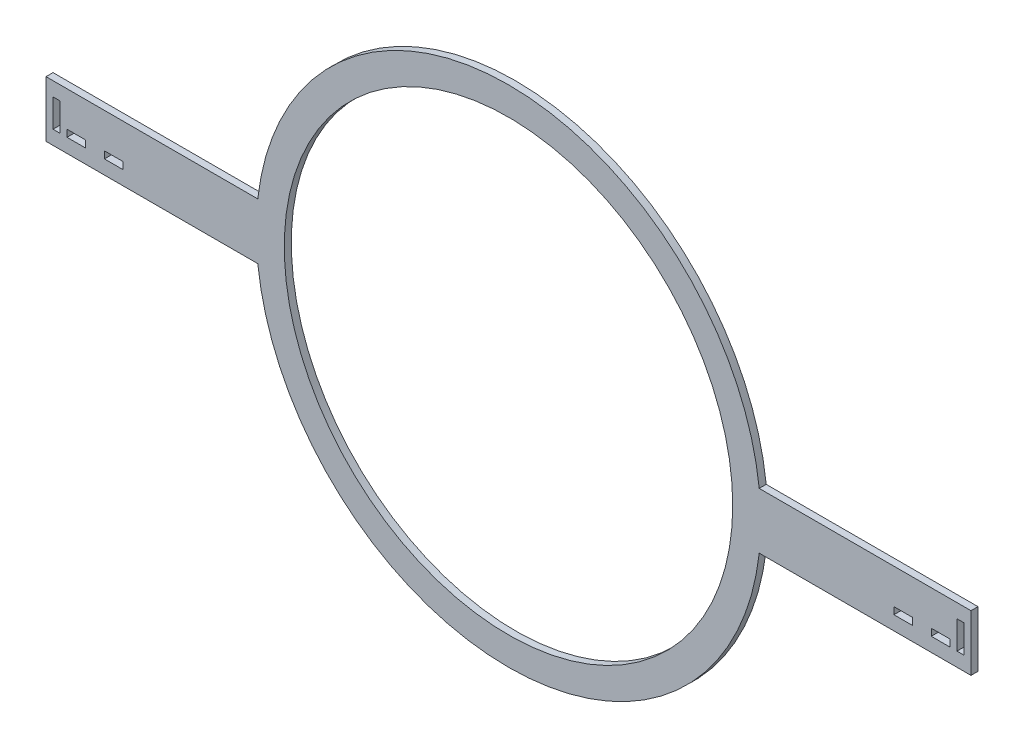
ISO-10303-21;
HEADER;
FILE_DESCRIPTION(('STEP AP214'),'2;1');
FILE_NAME('part.step','',(''),(''),'','','');
FILE_SCHEMA(('AUTOMOTIVE_DESIGN { 1 0 10303 214 1 1 1 1 }'));
ENDSEC;
DATA;
#1=APPLICATION_CONTEXT('core data for automotive mechanical design processes');
#2=APPLICATION_PROTOCOL_DEFINITION('international standard','automotive_design',2000,#1);
#3=PRODUCT_CONTEXT('',#1,'mechanical');
#4=PRODUCT('Part','Part','',(#3));
#5=PRODUCT_RELATED_PRODUCT_CATEGORY('part','',(#4));
#6=PRODUCT_DEFINITION_FORMATION('','',#4);
#7=PRODUCT_DEFINITION_CONTEXT('part definition',#1,'design');
#8=PRODUCT_DEFINITION('design','',#6,#7);
#9=PRODUCT_DEFINITION_SHAPE('','',#8);
#10=(LENGTH_UNIT() NAMED_UNIT(*) SI_UNIT(.MILLI.,.METRE.));
#11=(NAMED_UNIT(*) PLANE_ANGLE_UNIT() SI_UNIT($,.RADIAN.));
#12=(NAMED_UNIT(*) SI_UNIT($,.STERADIAN.) SOLID_ANGLE_UNIT());
#13=UNCERTAINTY_MEASURE_WITH_UNIT(LENGTH_MEASURE(1.E-05),#10,'distance_accuracy_value','');
#14=(GEOMETRIC_REPRESENTATION_CONTEXT(3) GLOBAL_UNCERTAINTY_ASSIGNED_CONTEXT((#13)) GLOBAL_UNIT_ASSIGNED_CONTEXT((#10,
#11,#12)) REPRESENTATION_CONTEXT('',''));
#15=CARTESIAN_POINT('',(0.,0.,0.));
#16=DIRECTION('',(0.,0.,1.));
#17=DIRECTION('',(1.,0.,0.));
#18=AXIS2_PLACEMENT_3D('',#15,#16,#17);
#19=CARTESIAN_POINT('',(0.,0.,3.175));
#20=DIRECTION('',(0.,0.,1.));
#21=DIRECTION('',(1.,0.,0.));
#22=AXIS2_PLACEMENT_3D('',#19,#20,#21);
#23=PLANE('',#22);
#24=DIRECTION('',(0.,1.,0.));
#25=VECTOR('',#24,1.);
#26=CARTESIAN_POINT('',(200.025,-3.175,3.175));
#27=LINE('',#26,#25);
#28=CARTESIAN_POINT('',(200.025,-6.35,3.175));
#29=VERTEX_POINT('',#28);
#30=CARTESIAN_POINT('',(200.025,-3.175,3.175));
#31=VERTEX_POINT('',#30);
#32=EDGE_CURVE('E325',#29,#31,#27,.T.);
#33=ORIENTED_EDGE('',*,*,#32,.F.);
#34=DIRECTION('',(1.,0.,0.));
#35=VECTOR('',#34,1.);
#36=CARTESIAN_POINT('',(200.025,-6.35,3.175));
#37=LINE('',#36,#35);
#38=CARTESIAN_POINT('',(191.558333333333,-6.35,3.175));
#39=VERTEX_POINT('',#38);
#40=EDGE_CURVE('E315',#39,#29,#37,.T.);
#41=ORIENTED_EDGE('',*,*,#40,.F.);
#42=DIRECTION('',(0.,-1.,0.));
#43=VECTOR('',#42,1.);
#44=CARTESIAN_POINT('',(191.558333333333,-3.175,3.175));
#45=LINE('',#44,#43);
#46=CARTESIAN_POINT('',(191.558333333333,-3.175,3.175));
#47=VERTEX_POINT('',#46);
#48=EDGE_CURVE('E331',#47,#39,#45,.T.);
#49=ORIENTED_EDGE('',*,*,#48,.F.);
#50=DIRECTION('',(-1.,0.,0.));
#51=VECTOR('',#50,1.);
#52=CARTESIAN_POINT('',(200.025,-3.175,3.175));
#53=LINE('',#52,#51);
#54=EDGE_CURVE('E327',#31,#47,#53,.T.);
#55=ORIENTED_EDGE('',*,*,#54,.F.);
#56=EDGE_LOOP('',(#33,#41,#49,#55));
#57=FACE_BOUND('',#56,.T.);
#58=DIRECTION('',(0.,1.,0.));
#59=VECTOR('',#58,1.);
#60=CARTESIAN_POINT('',(183.091666666667,-3.175,3.175));
#61=LINE('',#60,#59);
#62=CARTESIAN_POINT('',(183.091666666667,-6.35,3.175));
#63=VERTEX_POINT('',#62);
#64=CARTESIAN_POINT('',(183.091666666667,-3.175,3.175));
#65=VERTEX_POINT('',#64);
#66=EDGE_CURVE('E281',#63,#65,#61,.T.);
#67=ORIENTED_EDGE('',*,*,#66,.F.);
#68=DIRECTION('',(1.,0.,0.));
#69=VECTOR('',#68,1.);
#70=CARTESIAN_POINT('',(183.091666666667,-6.35,3.175));
#71=LINE('',#70,#69);
#72=CARTESIAN_POINT('',(174.625,-6.35,3.175));
#73=VERTEX_POINT('',#72);
#74=EDGE_CURVE('E349',#73,#63,#71,.T.);
#75=ORIENTED_EDGE('',*,*,#74,.F.);
#76=DIRECTION('',(0.,-1.,0.));
#77=VECTOR('',#76,1.);
#78=CARTESIAN_POINT('',(174.625,-3.175,3.175));
#79=LINE('',#78,#77);
#80=CARTESIAN_POINT('',(174.625,-3.175,3.175));
#81=VERTEX_POINT('',#80);
#82=EDGE_CURVE('E363',#81,#73,#79,.T.);
#83=ORIENTED_EDGE('',*,*,#82,.F.);
#84=DIRECTION('',(-1.,0.,0.));
#85=VECTOR('',#84,1.);
#86=CARTESIAN_POINT('',(183.091666666667,-3.175,3.175));
#87=LINE('',#86,#85);
#88=EDGE_CURVE('E360',#65,#81,#87,.T.);
#89=ORIENTED_EDGE('',*,*,#88,.F.);
#90=EDGE_LOOP('',(#67,#75,#83,#89));
#91=FACE_BOUND('',#90,.T.);
#92=DIRECTION('',(0.,-1.,0.));
#93=VECTOR('',#92,1.);
#94=CARTESIAN_POINT('',(-206.375,6.35,3.175));
#95=LINE('',#94,#93);
#96=CARTESIAN_POINT('',(-206.375,6.35,3.175));
#97=VERTEX_POINT('',#96);
#98=CARTESIAN_POINT('',(-206.375,-6.35,3.175));
#99=VERTEX_POINT('',#98);
#100=EDGE_CURVE('E399',#97,#99,#95,.T.);
#101=ORIENTED_EDGE('',*,*,#100,.F.);
#102=DIRECTION('',(-1.,0.,0.));
#103=VECTOR('',#102,1.);
#104=CARTESIAN_POINT('',(-206.375,6.35,3.175));
#105=LINE('',#104,#103);
#106=CARTESIAN_POINT('',(-203.2,6.35,3.175));
#107=VERTEX_POINT('',#106);
#108=EDGE_CURVE('E410',#107,#97,#105,.T.);
#109=ORIENTED_EDGE('',*,*,#108,.F.);
#110=DIRECTION('',(0.,1.,0.));
#111=VECTOR('',#110,1.);
#112=CARTESIAN_POINT('',(-203.2,6.35,3.175));
#113=LINE('',#112,#111);
#114=CARTESIAN_POINT('',(-203.2,-6.35,3.175));
#115=VERTEX_POINT('',#114);
#116=EDGE_CURVE('E424',#115,#107,#113,.T.);
#117=ORIENTED_EDGE('',*,*,#116,.F.);
#118=DIRECTION('',(1.,0.,0.));
#119=VECTOR('',#118,1.);
#120=CARTESIAN_POINT('',(-206.375,-6.35,3.175));
#121=LINE('',#120,#119);
#122=EDGE_CURVE('E421',#99,#115,#121,.T.);
#123=ORIENTED_EDGE('',*,*,#122,.F.);
#124=EDGE_LOOP('',(#101,#109,#117,#123));
#125=FACE_BOUND('',#124,.T.);
#126=DIRECTION('',(-1.,0.,0.));
#127=VECTOR('',#126,1.);
#128=CARTESIAN_POINT('',(0.,-12.7,3.175));
#129=LINE('',#128,#127);
#130=CARTESIAN_POINT('',(-113.592253256989,-12.7,3.175));
#131=VERTEX_POINT('',#130);
#132=CARTESIAN_POINT('',(-209.55,-12.7,3.175));
#133=VERTEX_POINT('',#132);
#134=EDGE_CURVE('E438',#131,#133,#129,.T.);
#135=ORIENTED_EDGE('',*,*,#134,.F.);
#136=CARTESIAN_POINT('',(0.,0.,3.175));
#137=DIRECTION('',(0.,0.,1.));
#138=DIRECTION('',(1.,0.,0.));
#139=AXIS2_PLACEMENT_3D('',#136,#137,#138);
#140=CIRCLE('',#139,114.3);
#141=CARTESIAN_POINT('',(113.592253256989,-12.7,3.175));
#142=VERTEX_POINT('',#141);
#143=EDGE_CURVE('E441',#131,#142,#140,.T.);
#144=ORIENTED_EDGE('',*,*,#143,.T.);
#145=DIRECTION('',(1.,0.,0.));
#146=VECTOR('',#145,1.);
#147=CARTESIAN_POINT('',(0.,-12.7,3.175));
#148=LINE('',#147,#146);
#149=CARTESIAN_POINT('',(209.55,-12.7,3.175));
#150=VERTEX_POINT('',#149);
#151=EDGE_CURVE('E444',#142,#150,#148,.T.);
#152=ORIENTED_EDGE('',*,*,#151,.T.);
#153=DIRECTION('',(0.,1.,0.));
#154=VECTOR('',#153,1.);
#155=CARTESIAN_POINT('',(209.55,0.,3.175));
#156=LINE('',#155,#154);
#157=CARTESIAN_POINT('',(209.55,12.7,3.175));
#158=VERTEX_POINT('',#157);
#159=EDGE_CURVE('E447',#150,#158,#156,.T.);
#160=ORIENTED_EDGE('',*,*,#159,.T.);
#161=DIRECTION('',(-1.,0.,0.));
#162=VECTOR('',#161,1.);
#163=CARTESIAN_POINT('',(0.,12.7,3.175));
#164=LINE('',#163,#162);
#165=CARTESIAN_POINT('',(113.592253256989,12.7,3.175));
#166=VERTEX_POINT('',#165);
#167=EDGE_CURVE('E449',#158,#166,#164,.T.);
#168=ORIENTED_EDGE('',*,*,#167,.T.);
#169=CARTESIAN_POINT('',(-113.592253256989,12.7,3.175));
#170=VERTEX_POINT('',#169);
#171=EDGE_CURVE('E445',#166,#170,#140,.T.);
#172=ORIENTED_EDGE('',*,*,#171,.T.);
#173=DIRECTION('',(1.,0.,0.));
#174=VECTOR('',#173,1.);
#175=CARTESIAN_POINT('',(0.,12.7,3.175));
#176=LINE('',#175,#174);
#177=CARTESIAN_POINT('',(-209.55,12.7,3.175));
#178=VERTEX_POINT('',#177);
#179=EDGE_CURVE('E451',#178,#170,#176,.T.);
#180=ORIENTED_EDGE('',*,*,#179,.F.);
#181=DIRECTION('',(0.,1.,0.));
#182=VECTOR('',#181,1.);
#183=CARTESIAN_POINT('',(-209.55,0.,3.175));
#184=LINE('',#183,#182);
#185=EDGE_CURVE('E454',#133,#178,#184,.T.);
#186=ORIENTED_EDGE('',*,*,#185,.F.);
#187=EDGE_LOOP('',(#135,#144,#152,#160,#168,#172,#180,#186));
#188=FACE_BOUND('',#187,.T.);
#189=CARTESIAN_POINT('',(0.,0.,3.175));
#190=DIRECTION('',(0.,0.,1.));
#191=DIRECTION('',(1.,0.,0.));
#192=AXIS2_PLACEMENT_3D('',#189,#190,#191);
#193=CIRCLE('',#192,101.6);
#194=CARTESIAN_POINT('',(101.6,0.,3.175));
#195=VERTEX_POINT('',#194);
#196=EDGE_CURVE('E457',#195,#195,#193,.T.);
#197=ORIENTED_EDGE('',*,*,#196,.F.);
#198=EDGE_LOOP('',(#197));
#199=FACE_BOUND('',#198,.T.);
#200=DIRECTION('',(1.,0.,0.));
#201=VECTOR('',#200,1.);
#202=CARTESIAN_POINT('',(206.375,6.35,3.175));
#203=LINE('',#202,#201);
#204=CARTESIAN_POINT('',(203.2,6.35,3.175));
#205=VERTEX_POINT('',#204);
#206=CARTESIAN_POINT('',(206.375,6.35,3.175));
#207=VERTEX_POINT('',#206);
#208=EDGE_CURVE('E388',#205,#207,#203,.T.);
#209=ORIENTED_EDGE('',*,*,#208,.T.);
#210=DIRECTION('',(0.,-1.,0.));
#211=VECTOR('',#210,1.);
#212=CARTESIAN_POINT('',(206.375,6.35,3.175));
#213=LINE('',#212,#211);
#214=CARTESIAN_POINT('',(206.375,-6.35,3.175));
#215=VERTEX_POINT('',#214);
#216=EDGE_CURVE('E338',#207,#215,#213,.T.);
#217=ORIENTED_EDGE('',*,*,#216,.T.);
#218=DIRECTION('',(-1.,0.,0.));
#219=VECTOR('',#218,1.);
#220=CARTESIAN_POINT('',(206.375,-6.35,3.175));
#221=LINE('',#220,#219);
#222=CARTESIAN_POINT('',(203.2,-6.35,3.175));
#223=VERTEX_POINT('',#222);
#224=EDGE_CURVE('E378',#215,#223,#221,.T.);
#225=ORIENTED_EDGE('',*,*,#224,.T.);
#226=DIRECTION('',(0.,1.,0.));
#227=VECTOR('',#226,1.);
#228=CARTESIAN_POINT('',(203.2,6.35,3.175));
#229=LINE('',#228,#227);
#230=EDGE_CURVE('E391',#223,#205,#229,.T.);
#231=ORIENTED_EDGE('',*,*,#230,.T.);
#232=EDGE_LOOP('',(#209,#217,#225,#231));
#233=FACE_BOUND('',#232,.T.);
#234=DIRECTION('',(-1.,0.,0.));
#235=VECTOR('',#234,1.);
#236=CARTESIAN_POINT('',(-183.091666666667,-6.35,3.175));
#237=LINE('',#236,#235);
#238=CARTESIAN_POINT('',(-174.625,-6.35,3.175));
#239=VERTEX_POINT('',#238);
#240=CARTESIAN_POINT('',(-183.091666666667,-6.35,3.175));
#241=VERTEX_POINT('',#240);
#242=EDGE_CURVE('E297',#239,#241,#237,.T.);
#243=ORIENTED_EDGE('',*,*,#242,.T.);
#244=DIRECTION('',(0.,1.,0.));
#245=VECTOR('',#244,1.);
#246=CARTESIAN_POINT('',(-183.091666666667,-3.175,3.175));
#247=LINE('',#246,#245);
#248=CARTESIAN_POINT('',(-183.091666666667,-3.175,3.175));
#249=VERTEX_POINT('',#248);
#250=EDGE_CURVE('E58',#241,#249,#247,.T.);
#251=ORIENTED_EDGE('',*,*,#250,.T.);
#252=DIRECTION('',(1.,0.,0.));
#253=VECTOR('',#252,1.);
#254=CARTESIAN_POINT('',(-183.091666666667,-3.175,3.175));
#255=LINE('',#254,#253);
#256=CARTESIAN_POINT('',(-174.625,-3.175,3.175));
#257=VERTEX_POINT('',#256);
#258=EDGE_CURVE('E288',#249,#257,#255,.T.);
#259=ORIENTED_EDGE('',*,*,#258,.T.);
#260=DIRECTION('',(0.,-1.,0.));
#261=VECTOR('',#260,1.);
#262=CARTESIAN_POINT('',(-174.625,-3.175,3.175));
#263=LINE('',#262,#261);
#264=EDGE_CURVE('E300',#257,#239,#263,.T.);
#265=ORIENTED_EDGE('',*,*,#264,.T.);
#266=EDGE_LOOP('',(#243,#251,#259,#265));
#267=FACE_BOUND('',#266,.T.);
#268=DIRECTION('',(-1.,0.,0.));
#269=VECTOR('',#268,1.);
#270=CARTESIAN_POINT('',(-200.025,-6.35,3.175));
#271=LINE('',#270,#269);
#272=CARTESIAN_POINT('',(-191.558333333333,-6.35,3.175));
#273=VERTEX_POINT('',#272);
#274=CARTESIAN_POINT('',(-200.025,-6.35,3.175));
#275=VERTEX_POINT('',#274);
#276=EDGE_CURVE('E274',#273,#275,#271,.T.);
#277=ORIENTED_EDGE('',*,*,#276,.T.);
#278=DIRECTION('',(0.,1.,0.));
#279=VECTOR('',#278,1.);
#280=CARTESIAN_POINT('',(-200.025,-3.175,3.175));
#281=LINE('',#280,#279);
#282=CARTESIAN_POINT('',(-200.025,-3.175,3.175));
#283=VERTEX_POINT('',#282);
#284=EDGE_CURVE('E50',#275,#283,#281,.T.);
#285=ORIENTED_EDGE('',*,*,#284,.T.);
#286=DIRECTION('',(1.,0.,0.));
#287=VECTOR('',#286,1.);
#288=CARTESIAN_POINT('',(-200.025,-3.175,3.175));
#289=LINE('',#288,#287);
#290=CARTESIAN_POINT('',(-191.558333333333,-3.175,3.175));
#291=VERTEX_POINT('',#290);
#292=EDGE_CURVE('E265',#283,#291,#289,.T.);
#293=ORIENTED_EDGE('',*,*,#292,.T.);
#294=DIRECTION('',(0.,-1.,0.));
#295=VECTOR('',#294,1.);
#296=CARTESIAN_POINT('',(-191.558333333333,-3.175,3.175));
#297=LINE('',#296,#295);
#298=EDGE_CURVE('E268',#291,#273,#297,.T.);
#299=ORIENTED_EDGE('',*,*,#298,.T.);
#300=EDGE_LOOP('',(#277,#285,#293,#299));
#301=FACE_BOUND('',#300,.T.);
#302=ADVANCED_FACE('F35',(#57,#91,#125,#188,#199,#233,#267,#301),#23,.T.);
#303=CARTESIAN_POINT('',(0.,0.,0.));
#304=DIRECTION('',(0.,0.,1.));
#305=DIRECTION('',(1.,0.,0.));
#306=AXIS2_PLACEMENT_3D('',#303,#304,#305);
#307=PLANE('',#306);
#308=DIRECTION('',(0.,1.,0.));
#309=VECTOR('',#308,1.);
#310=CARTESIAN_POINT('',(-183.091666666667,-3.175,0.));
#311=LINE('',#310,#309);
#312=CARTESIAN_POINT('',(-183.091666666667,-6.35,0.));
#313=VERTEX_POINT('',#312);
#314=CARTESIAN_POINT('',(-183.091666666667,-3.175,0.));
#315=VERTEX_POINT('',#314);
#316=EDGE_CURVE('E285',#313,#315,#311,.T.);
#317=ORIENTED_EDGE('',*,*,#316,.F.);
#318=DIRECTION('',(-1.,0.,0.));
#319=VECTOR('',#318,1.);
#320=CARTESIAN_POINT('',(-183.091666666667,-6.35,0.));
#321=LINE('',#320,#319);
#322=CARTESIAN_POINT('',(-174.625,-6.35,0.));
#323=VERTEX_POINT('',#322);
#324=EDGE_CURVE('E287',#323,#313,#321,.T.);
#325=ORIENTED_EDGE('',*,*,#324,.F.);
#326=DIRECTION('',(0.,-1.,0.));
#327=VECTOR('',#326,1.);
#328=CARTESIAN_POINT('',(-174.625,-3.175,0.));
#329=LINE('',#328,#327);
#330=CARTESIAN_POINT('',(-174.625,-3.175,0.));
#331=VERTEX_POINT('',#330);
#332=EDGE_CURVE('E290',#331,#323,#329,.T.);
#333=ORIENTED_EDGE('',*,*,#332,.F.);
#334=DIRECTION('',(1.,0.,0.));
#335=VECTOR('',#334,1.);
#336=CARTESIAN_POINT('',(-183.091666666667,-3.175,0.));
#337=LINE('',#336,#335);
#338=EDGE_CURVE('E293',#315,#331,#337,.T.);
#339=ORIENTED_EDGE('',*,*,#338,.F.);
#340=EDGE_LOOP('',(#317,#325,#333,#339));
#341=FACE_BOUND('',#340,.T.);
#342=DIRECTION('',(1.,0.,0.));
#343=VECTOR('',#342,1.);
#344=CARTESIAN_POINT('',(200.025,-6.35,0.));
#345=LINE('',#344,#343);
#346=CARTESIAN_POINT('',(191.558333333333,-6.35,0.));
#347=VERTEX_POINT('',#346);
#348=CARTESIAN_POINT('',(200.025,-6.35,0.));
#349=VERTEX_POINT('',#348);
#350=EDGE_CURVE('E321',#347,#349,#345,.T.);
#351=ORIENTED_EDGE('',*,*,#350,.T.);
#352=DIRECTION('',(0.,1.,0.));
#353=VECTOR('',#352,1.);
#354=CARTESIAN_POINT('',(200.025,-3.175,0.));
#355=LINE('',#354,#353);
#356=CARTESIAN_POINT('',(200.025,-3.175,0.));
#357=VERTEX_POINT('',#356);
#358=EDGE_CURVE('E311',#349,#357,#355,.T.);
#359=ORIENTED_EDGE('',*,*,#358,.T.);
#360=DIRECTION('',(-1.,0.,0.));
#361=VECTOR('',#360,1.);
#362=CARTESIAN_POINT('',(200.025,-3.175,0.));
#363=LINE('',#362,#361);
#364=CARTESIAN_POINT('',(191.558333333333,-3.175,0.));
#365=VERTEX_POINT('',#364);
#366=EDGE_CURVE('E314',#357,#365,#363,.T.);
#367=ORIENTED_EDGE('',*,*,#366,.T.);
#368=DIRECTION('',(0.,-1.,0.));
#369=VECTOR('',#368,1.);
#370=CARTESIAN_POINT('',(191.558333333333,-3.175,0.));
#371=LINE('',#370,#369);
#372=EDGE_CURVE('E318',#365,#347,#371,.T.);
#373=ORIENTED_EDGE('',*,*,#372,.T.);
#374=EDGE_LOOP('',(#351,#359,#367,#373));
#375=FACE_BOUND('',#374,.T.);
#376=DIRECTION('',(1.,0.,0.));
#377=VECTOR('',#376,1.);
#378=CARTESIAN_POINT('',(183.091666666667,-6.35,0.));
#379=LINE('',#378,#377);
#380=CARTESIAN_POINT('',(174.625,-6.35,0.));
#381=VERTEX_POINT('',#380);
#382=CARTESIAN_POINT('',(183.091666666667,-6.35,0.));
#383=VERTEX_POINT('',#382);
#384=EDGE_CURVE('E355',#381,#383,#379,.T.);
#385=ORIENTED_EDGE('',*,*,#384,.T.);
#386=DIRECTION('',(0.,1.,0.));
#387=VECTOR('',#386,1.);
#388=CARTESIAN_POINT('',(183.091666666667,-3.175,0.));
#389=LINE('',#388,#387);
#390=CARTESIAN_POINT('',(183.091666666667,-3.175,0.));
#391=VERTEX_POINT('',#390);
#392=EDGE_CURVE('E345',#383,#391,#389,.T.);
#393=ORIENTED_EDGE('',*,*,#392,.T.);
#394=DIRECTION('',(-1.,0.,0.));
#395=VECTOR('',#394,1.);
#396=CARTESIAN_POINT('',(183.091666666667,-3.175,0.));
#397=LINE('',#396,#395);
#398=CARTESIAN_POINT('',(174.625,-3.175,0.));
#399=VERTEX_POINT('',#398);
#400=EDGE_CURVE('E348',#391,#399,#397,.T.);
#401=ORIENTED_EDGE('',*,*,#400,.T.);
#402=DIRECTION('',(0.,-1.,0.));
#403=VECTOR('',#402,1.);
#404=CARTESIAN_POINT('',(174.625,-3.175,0.));
#405=LINE('',#404,#403);
#406=EDGE_CURVE('E352',#399,#381,#405,.T.);
#407=ORIENTED_EDGE('',*,*,#406,.T.);
#408=EDGE_LOOP('',(#385,#393,#401,#407));
#409=FACE_BOUND('',#408,.T.);
#410=CARTESIAN_POINT('',(0.,0.,0.));
#411=DIRECTION('',(0.,0.,1.));
#412=DIRECTION('',(1.,0.,0.));
#413=AXIS2_PLACEMENT_3D('',#410,#411,#412);
#414=CIRCLE('',#413,101.6);
#415=CARTESIAN_POINT('',(101.6,0.,0.));
#416=VERTEX_POINT('',#415);
#417=EDGE_CURVE('E442',#416,#416,#414,.T.);
#418=ORIENTED_EDGE('',*,*,#417,.T.);
#419=EDGE_LOOP('',(#418));
#420=FACE_BOUND('',#419,.T.);
#421=DIRECTION('',(-1.,0.,0.));
#422=VECTOR('',#421,1.);
#423=CARTESIAN_POINT('',(0.,-12.7,0.));
#424=LINE('',#423,#422);
#425=CARTESIAN_POINT('',(-113.592253256989,-12.7,0.));
#426=VERTEX_POINT('',#425);
#427=CARTESIAN_POINT('',(-209.55,-12.7,0.));
#428=VERTEX_POINT('',#427);
#429=EDGE_CURVE('E431',#426,#428,#424,.T.);
#430=ORIENTED_EDGE('',*,*,#429,.T.);
#431=DIRECTION('',(0.,1.,0.));
#432=VECTOR('',#431,1.);
#433=CARTESIAN_POINT('',(-209.55,0.,0.));
#434=LINE('',#433,#432);
#435=CARTESIAN_POINT('',(-209.55,12.7,0.));
#436=VERTEX_POINT('',#435);
#437=EDGE_CURVE('E475',#428,#436,#434,.T.);
#438=ORIENTED_EDGE('',*,*,#437,.T.);
#439=DIRECTION('',(1.,0.,0.));
#440=VECTOR('',#439,1.);
#441=CARTESIAN_POINT('',(0.,12.7,0.));
#442=LINE('',#441,#440);
#443=CARTESIAN_POINT('',(-113.592253256989,12.7,0.));
#444=VERTEX_POINT('',#443);
#445=EDGE_CURVE('E472',#436,#444,#442,.T.);
#446=ORIENTED_EDGE('',*,*,#445,.T.);
#447=CARTESIAN_POINT('',(0.,0.,0.));
#448=DIRECTION('',(0.,0.,1.));
#449=DIRECTION('',(1.,0.,0.));
#450=AXIS2_PLACEMENT_3D('',#447,#448,#449);
#451=CIRCLE('',#450,114.3);
#452=CARTESIAN_POINT('',(113.592253256989,12.7,0.));
#453=VERTEX_POINT('',#452);
#454=EDGE_CURVE('E466',#453,#444,#451,.T.);
#455=ORIENTED_EDGE('',*,*,#454,.F.);
#456=DIRECTION('',(-1.,0.,0.));
#457=VECTOR('',#456,1.);
#458=CARTESIAN_POINT('',(0.,12.7,0.));
#459=LINE('',#458,#457);
#460=CARTESIAN_POINT('',(209.55,12.7,0.));
#461=VERTEX_POINT('',#460);
#462=EDGE_CURVE('E470',#461,#453,#459,.T.);
#463=ORIENTED_EDGE('',*,*,#462,.F.);
#464=DIRECTION('',(0.,1.,0.));
#465=VECTOR('',#464,1.);
#466=CARTESIAN_POINT('',(209.55,0.,0.));
#467=LINE('',#466,#465);
#468=CARTESIAN_POINT('',(209.55,-12.7,0.));
#469=VERTEX_POINT('',#468);
#470=EDGE_CURVE('E468',#469,#461,#467,.T.);
#471=ORIENTED_EDGE('',*,*,#470,.F.);
#472=DIRECTION('',(1.,0.,0.));
#473=VECTOR('',#472,1.);
#474=CARTESIAN_POINT('',(0.,-12.7,0.));
#475=LINE('',#474,#473);
#476=CARTESIAN_POINT('',(113.592253256989,-12.7,0.));
#477=VERTEX_POINT('',#476);
#478=EDGE_CURVE('E465',#477,#469,#475,.T.);
#479=ORIENTED_EDGE('',*,*,#478,.F.);
#480=EDGE_CURVE('E463',#426,#477,#451,.T.);
#481=ORIENTED_EDGE('',*,*,#480,.F.);
#482=EDGE_LOOP('',(#430,#438,#446,#455,#463,#471,#479,#481));
#483=FACE_BOUND('',#482,.T.);
#484=DIRECTION('',(-1.,0.,0.));
#485=VECTOR('',#484,1.);
#486=CARTESIAN_POINT('',(-206.375,6.35,0.));
#487=LINE('',#486,#485);
#488=CARTESIAN_POINT('',(-203.2,6.35,0.));
#489=VERTEX_POINT('',#488);
#490=CARTESIAN_POINT('',(-206.375,6.35,0.));
#491=VERTEX_POINT('',#490);
#492=EDGE_CURVE('E416',#489,#491,#487,.T.);
#493=ORIENTED_EDGE('',*,*,#492,.T.);
#494=DIRECTION('',(0.,-1.,0.));
#495=VECTOR('',#494,1.);
#496=CARTESIAN_POINT('',(-206.375,6.35,0.));
#497=LINE('',#496,#495);
#498=CARTESIAN_POINT('',(-206.375,-6.35,0.));
#499=VERTEX_POINT('',#498);
#500=EDGE_CURVE('E406',#491,#499,#497,.T.);
#501=ORIENTED_EDGE('',*,*,#500,.T.);
#502=DIRECTION('',(1.,0.,0.));
#503=VECTOR('',#502,1.);
#504=CARTESIAN_POINT('',(-206.375,-6.35,0.));
#505=LINE('',#504,#503);
#506=CARTESIAN_POINT('',(-203.2,-6.35,0.));
#507=VERTEX_POINT('',#506);
#508=EDGE_CURVE('E409',#499,#507,#505,.T.);
#509=ORIENTED_EDGE('',*,*,#508,.T.);
#510=DIRECTION('',(0.,1.,0.));
#511=VECTOR('',#510,1.);
#512=CARTESIAN_POINT('',(-203.2,6.35,0.));
#513=LINE('',#512,#511);
#514=EDGE_CURVE('E413',#507,#489,#513,.T.);
#515=ORIENTED_EDGE('',*,*,#514,.T.);
#516=EDGE_LOOP('',(#493,#501,#509,#515));
#517=FACE_BOUND('',#516,.T.);
#518=DIRECTION('',(0.,-1.,0.));
#519=VECTOR('',#518,1.);
#520=CARTESIAN_POINT('',(206.375,6.35,0.));
#521=LINE('',#520,#519);
#522=CARTESIAN_POINT('',(206.375,6.35,0.));
#523=VERTEX_POINT('',#522);
#524=CARTESIAN_POINT('',(206.375,-6.35,0.));
#525=VERTEX_POINT('',#524);
#526=EDGE_CURVE('E375',#523,#525,#521,.T.);
#527=ORIENTED_EDGE('',*,*,#526,.F.);
#528=DIRECTION('',(1.,0.,0.));
#529=VECTOR('',#528,1.);
#530=CARTESIAN_POINT('',(206.375,6.35,0.));
#531=LINE('',#530,#529);
#532=CARTESIAN_POINT('',(203.2,6.35,0.));
#533=VERTEX_POINT('',#532);
#534=EDGE_CURVE('E377',#533,#523,#531,.T.);
#535=ORIENTED_EDGE('',*,*,#534,.F.);
#536=DIRECTION('',(0.,1.,0.));
#537=VECTOR('',#536,1.);
#538=CARTESIAN_POINT('',(203.2,6.35,0.));
#539=LINE('',#538,#537);
#540=CARTESIAN_POINT('',(203.2,-6.35,0.));
#541=VERTEX_POINT('',#540);
#542=EDGE_CURVE('E380',#541,#533,#539,.T.);
#543=ORIENTED_EDGE('',*,*,#542,.F.);
#544=DIRECTION('',(-1.,0.,0.));
#545=VECTOR('',#544,1.);
#546=CARTESIAN_POINT('',(206.375,-6.35,0.));
#547=LINE('',#546,#545);
#548=EDGE_CURVE('E383',#525,#541,#547,.T.);
#549=ORIENTED_EDGE('',*,*,#548,.F.);
#550=EDGE_LOOP('',(#527,#535,#543,#549));
#551=FACE_BOUND('',#550,.T.);
#552=DIRECTION('',(0.,1.,0.));
#553=VECTOR('',#552,1.);
#554=CARTESIAN_POINT('',(-200.025,-3.175,0.));
#555=LINE('',#554,#553);
#556=CARTESIAN_POINT('',(-200.025,-6.35,0.));
#557=VERTEX_POINT('',#556);
#558=CARTESIAN_POINT('',(-200.025,-3.175,0.));
#559=VERTEX_POINT('',#558);
#560=EDGE_CURVE('E257',#557,#559,#555,.T.);
#561=ORIENTED_EDGE('',*,*,#560,.F.);
#562=DIRECTION('',(-1.,0.,0.));
#563=VECTOR('',#562,1.);
#564=CARTESIAN_POINT('',(-200.025,-6.35,0.));
#565=LINE('',#564,#563);
#566=CARTESIAN_POINT('',(-191.558333333333,-6.35,0.));
#567=VERTEX_POINT('',#566);
#568=EDGE_CURVE('E246',#567,#557,#565,.T.);
#569=ORIENTED_EDGE('',*,*,#568,.F.);
#570=DIRECTION('',(0.,-1.,0.));
#571=VECTOR('',#570,1.);
#572=CARTESIAN_POINT('',(-191.558333333333,-3.175,0.));
#573=LINE('',#572,#571);
#574=CARTESIAN_POINT('',(-191.558333333333,-3.175,0.));
#575=VERTEX_POINT('',#574);
#576=EDGE_CURVE('E256',#575,#567,#573,.T.);
#577=ORIENTED_EDGE('',*,*,#576,.F.);
#578=DIRECTION('',(1.,0.,0.));
#579=VECTOR('',#578,1.);
#580=CARTESIAN_POINT('',(-200.025,-3.175,0.));
#581=LINE('',#580,#579);
#582=EDGE_CURVE('E261',#559,#575,#581,.T.);
#583=ORIENTED_EDGE('',*,*,#582,.F.);
#584=EDGE_LOOP('',(#561,#569,#577,#583));
#585=FACE_BOUND('',#584,.T.);
#586=ADVANCED_FACE('F264',(#341,#375,#409,#420,#483,#517,#551,#585),#307,.F.);
#587=CARTESIAN_POINT('',(0.,-12.7,3.175));
#588=DIRECTION('',(0.,-1.,0.));
#589=DIRECTION('',(1.,0.,0.));
#590=AXIS2_PLACEMENT_3D('',#587,#588,#589);
#591=PLANE('',#590);
#592=ORIENTED_EDGE('',*,*,#429,.F.);
#593=DIRECTION('',(0.,0.,-1.));
#594=VECTOR('',#593,1.);
#595=CARTESIAN_POINT('',(-113.592253256989,-12.7,3.175));
#596=LINE('',#595,#594);
#597=EDGE_CURVE('E11',#131,#426,#596,.T.);
#598=ORIENTED_EDGE('',*,*,#597,.F.);
#599=ORIENTED_EDGE('',*,*,#134,.T.);
#600=DIRECTION('',(0.,0.,-1.));
#601=VECTOR('',#600,1.);
#602=CARTESIAN_POINT('',(-209.55,-12.7,3.175));
#603=LINE('',#602,#601);
#604=EDGE_CURVE('E460',#133,#428,#603,.T.);
#605=ORIENTED_EDGE('',*,*,#604,.T.);
#606=EDGE_LOOP('',(#592,#598,#599,#605));
#607=FACE_BOUND('',#606,.T.);
#608=ADVANCED_FACE('F37',(#607),#591,.T.);
#609=CARTESIAN_POINT('',(0.,0.,3.175));
#610=DIRECTION('',(0.,0.,-1.));
#611=DIRECTION('',(-1.,0.,0.));
#612=AXIS2_PLACEMENT_3D('',#609,#610,#611);
#613=CYLINDRICAL_SURFACE('',#612,114.3);
#614=ORIENTED_EDGE('',*,*,#480,.T.);
#615=DIRECTION('',(0.,0.,-1.));
#616=VECTOR('',#615,1.);
#617=CARTESIAN_POINT('',(113.592253256989,-12.7,3.175));
#618=LINE('',#617,#616);
#619=EDGE_CURVE('E43',#142,#477,#618,.T.);
#620=ORIENTED_EDGE('',*,*,#619,.F.);
#621=ORIENTED_EDGE('',*,*,#143,.F.);
#622=ORIENTED_EDGE('',*,*,#597,.T.);
#623=EDGE_LOOP('',(#614,#620,#621,#622));
#624=FACE_BOUND('',#623,.T.);
#625=ADVANCED_FACE('F524',(#624),#613,.T.);
#626=CARTESIAN_POINT('',(0.,-12.7,3.175));
#627=DIRECTION('',(0.,1.,0.));
#628=DIRECTION('',(-1.,0.,0.));
#629=AXIS2_PLACEMENT_3D('',#626,#627,#628);
#630=PLANE('',#629);
#631=ORIENTED_EDGE('',*,*,#478,.T.);
#632=DIRECTION('',(0.,0.,-1.));
#633=VECTOR('',#632,1.);
#634=CARTESIAN_POINT('',(209.55,-12.7,3.175));
#635=LINE('',#634,#633);
#636=EDGE_CURVE('E491',#150,#469,#635,.T.);
#637=ORIENTED_EDGE('',*,*,#636,.F.);
#638=ORIENTED_EDGE('',*,*,#151,.F.);
#639=ORIENTED_EDGE('',*,*,#619,.T.);
#640=EDGE_LOOP('',(#631,#637,#638,#639));
#641=FACE_BOUND('',#640,.T.);
#642=ADVANCED_FACE('F498',(#641),#630,.F.);
#643=CARTESIAN_POINT('',(209.55,0.,3.175));
#644=DIRECTION('',(-1.,0.,0.));
#645=DIRECTION('',(0.,0.,1.));
#646=AXIS2_PLACEMENT_3D('',#643,#644,#645);
#647=PLANE('',#646);
#648=ORIENTED_EDGE('',*,*,#470,.T.);
#649=DIRECTION('',(0.,0.,-1.));
#650=VECTOR('',#649,1.);
#651=CARTESIAN_POINT('',(209.55,12.7,3.175));
#652=LINE('',#651,#650);
#653=EDGE_CURVE('E488',#158,#461,#652,.T.);
#654=ORIENTED_EDGE('',*,*,#653,.F.);
#655=ORIENTED_EDGE('',*,*,#159,.F.);
#656=ORIENTED_EDGE('',*,*,#636,.T.);
#657=EDGE_LOOP('',(#648,#654,#655,#656));
#658=FACE_BOUND('',#657,.T.);
#659=ADVANCED_FACE('F511',(#658),#647,.F.);
#660=CARTESIAN_POINT('',(0.,12.7,3.175));
#661=DIRECTION('',(0.,-1.,0.));
#662=DIRECTION('',(1.,0.,0.));
#663=AXIS2_PLACEMENT_3D('',#660,#661,#662);
#664=PLANE('',#663);
#665=ORIENTED_EDGE('',*,*,#462,.T.);
#666=DIRECTION('',(0.,0.,-1.));
#667=VECTOR('',#666,1.);
#668=CARTESIAN_POINT('',(113.592253256989,12.7,3.175));
#669=LINE('',#668,#667);
#670=EDGE_CURVE('E485',#166,#453,#669,.T.);
#671=ORIENTED_EDGE('',*,*,#670,.F.);
#672=ORIENTED_EDGE('',*,*,#167,.F.);
#673=ORIENTED_EDGE('',*,*,#653,.T.);
#674=EDGE_LOOP('',(#665,#671,#672,#673));
#675=FACE_BOUND('',#674,.T.);
#676=ADVANCED_FACE('F515',(#675),#664,.F.);
#677=ORIENTED_EDGE('',*,*,#454,.T.);
#678=DIRECTION('',(0.,0.,-1.));
#679=VECTOR('',#678,1.);
#680=CARTESIAN_POINT('',(-113.592253256989,12.7,3.175));
#681=LINE('',#680,#679);
#682=EDGE_CURVE('E483',#170,#444,#681,.T.);
#683=ORIENTED_EDGE('',*,*,#682,.F.);
#684=ORIENTED_EDGE('',*,*,#171,.F.);
#685=ORIENTED_EDGE('',*,*,#670,.T.);
#686=EDGE_LOOP('',(#677,#683,#684,#685));
#687=FACE_BOUND('',#686,.T.);
#688=ADVANCED_FACE('F534',(#687),#613,.T.);
#689=CARTESIAN_POINT('',(0.,12.7,3.175));
#690=DIRECTION('',(0.,1.,0.));
#691=DIRECTION('',(-1.,0.,0.));
#692=AXIS2_PLACEMENT_3D('',#689,#690,#691);
#693=PLANE('',#692);
#694=ORIENTED_EDGE('',*,*,#445,.F.);
#695=DIRECTION('',(0.,0.,-1.));
#696=VECTOR('',#695,1.);
#697=CARTESIAN_POINT('',(-209.55,12.7,3.175));
#698=LINE('',#697,#696);
#699=EDGE_CURVE('E481',#178,#436,#698,.T.);
#700=ORIENTED_EDGE('',*,*,#699,.F.);
#701=ORIENTED_EDGE('',*,*,#179,.T.);
#702=ORIENTED_EDGE('',*,*,#682,.T.);
#703=EDGE_LOOP('',(#694,#700,#701,#702));
#704=FACE_BOUND('',#703,.T.);
#705=ADVANCED_FACE('F531',(#704),#693,.T.);
#706=CARTESIAN_POINT('',(-209.55,0.,3.175));
#707=DIRECTION('',(-1.,0.,0.));
#708=DIRECTION('',(0.,0.,1.));
#709=AXIS2_PLACEMENT_3D('',#706,#707,#708);
#710=PLANE('',#709);
#711=ORIENTED_EDGE('',*,*,#437,.F.);
#712=ORIENTED_EDGE('',*,*,#604,.F.);
#713=ORIENTED_EDGE('',*,*,#185,.T.);
#714=ORIENTED_EDGE('',*,*,#699,.T.);
#715=EDGE_LOOP('',(#711,#712,#713,#714));
#716=FACE_BOUND('',#715,.T.);
#717=ADVANCED_FACE('F528',(#716),#710,.T.);
#718=CARTESIAN_POINT('',(0.,0.,3.175));
#719=DIRECTION('',(0.,0.,-1.));
#720=DIRECTION('',(-1.,0.,0.));
#721=AXIS2_PLACEMENT_3D('',#718,#719,#720);
#722=CYLINDRICAL_SURFACE('',#721,101.6);
#723=ORIENTED_EDGE('',*,*,#196,.T.);
#724=EDGE_LOOP('',(#723));
#725=FACE_BOUND('',#724,.T.);
#726=ORIENTED_EDGE('',*,*,#417,.F.);
#727=EDGE_LOOP('',(#726));
#728=FACE_BOUND('',#727,.T.);
#729=ADVANCED_FACE('F559',(#725,#728),#722,.F.);
#730=CARTESIAN_POINT('',(-206.375,6.35,0.));
#731=DIRECTION('',(-1.,0.,0.));
#732=DIRECTION('',(0.,0.,1.));
#733=AXIS2_PLACEMENT_3D('',#730,#731,#732);
#734=PLANE('',#733);
#735=ORIENTED_EDGE('',*,*,#100,.T.);
#736=DIRECTION('',(0.,0.,1.));
#737=VECTOR('',#736,1.);
#738=CARTESIAN_POINT('',(-206.375,-6.35,0.));
#739=LINE('',#738,#737);
#740=EDGE_CURVE('E419',#499,#99,#739,.T.);
#741=ORIENTED_EDGE('',*,*,#740,.F.);
#742=ORIENTED_EDGE('',*,*,#500,.F.);
#743=DIRECTION('',(0.,0.,1.));
#744=VECTOR('',#743,1.);
#745=CARTESIAN_POINT('',(-206.375,6.35,0.));
#746=LINE('',#745,#744);
#747=EDGE_CURVE('E429',#491,#97,#746,.T.);
#748=ORIENTED_EDGE('',*,*,#747,.T.);
#749=EDGE_LOOP('',(#735,#741,#742,#748));
#750=FACE_BOUND('',#749,.T.);
#751=ADVANCED_FACE('F556',(#750),#734,.F.);
#752=CARTESIAN_POINT('',(-206.375,6.35,0.));
#753=DIRECTION('',(0.,1.,0.));
#754=DIRECTION('',(0.,0.,1.));
#755=AXIS2_PLACEMENT_3D('',#752,#753,#754);
#756=PLANE('',#755);
#757=ORIENTED_EDGE('',*,*,#108,.T.);
#758=ORIENTED_EDGE('',*,*,#747,.F.);
#759=ORIENTED_EDGE('',*,*,#492,.F.);
#760=DIRECTION('',(0.,0.,1.));
#761=VECTOR('',#760,1.);
#762=CARTESIAN_POINT('',(-203.2,6.35,0.));
#763=LINE('',#762,#761);
#764=EDGE_CURVE('E432',#489,#107,#763,.T.);
#765=ORIENTED_EDGE('',*,*,#764,.T.);
#766=EDGE_LOOP('',(#757,#758,#759,#765));
#767=FACE_BOUND('',#766,.T.);
#768=ADVANCED_FACE('F578',(#767),#756,.F.);
#769=CARTESIAN_POINT('',(-203.2,6.35,0.));
#770=DIRECTION('',(1.,0.,0.));
#771=DIRECTION('',(0.,0.,-1.));
#772=AXIS2_PLACEMENT_3D('',#769,#770,#771);
#773=PLANE('',#772);
#774=ORIENTED_EDGE('',*,*,#116,.T.);
#775=ORIENTED_EDGE('',*,*,#764,.F.);
#776=ORIENTED_EDGE('',*,*,#514,.F.);
#777=DIRECTION('',(0.,0.,1.));
#778=VECTOR('',#777,1.);
#779=CARTESIAN_POINT('',(-203.2,-6.35,0.));
#780=LINE('',#779,#778);
#781=EDGE_CURVE('E434',#507,#115,#780,.T.);
#782=ORIENTED_EDGE('',*,*,#781,.T.);
#783=EDGE_LOOP('',(#774,#775,#776,#782));
#784=FACE_BOUND('',#783,.T.);
#785=ADVANCED_FACE('F585',(#784),#773,.F.);
#786=CARTESIAN_POINT('',(-206.375,-6.35,0.));
#787=DIRECTION('',(0.,-1.,0.));
#788=DIRECTION('',(0.,0.,-1.));
#789=AXIS2_PLACEMENT_3D('',#786,#787,#788);
#790=PLANE('',#789);
#791=ORIENTED_EDGE('',*,*,#122,.T.);
#792=ORIENTED_EDGE('',*,*,#781,.F.);
#793=ORIENTED_EDGE('',*,*,#508,.F.);
#794=ORIENTED_EDGE('',*,*,#740,.T.);
#795=EDGE_LOOP('',(#791,#792,#793,#794));
#796=FACE_BOUND('',#795,.T.);
#797=ADVANCED_FACE('F593',(#796),#790,.F.);
#798=CARTESIAN_POINT('',(206.375,6.35,0.));
#799=DIRECTION('',(-1.,0.,0.));
#800=DIRECTION('',(0.,0.,1.));
#801=AXIS2_PLACEMENT_3D('',#798,#799,#800);
#802=PLANE('',#801);
#803=ORIENTED_EDGE('',*,*,#216,.F.);
#804=DIRECTION('',(0.,0.,1.));
#805=VECTOR('',#804,1.);
#806=CARTESIAN_POINT('',(206.375,6.35,0.));
#807=LINE('',#806,#805);
#808=EDGE_CURVE('E385',#523,#207,#807,.T.);
#809=ORIENTED_EDGE('',*,*,#808,.F.);
#810=ORIENTED_EDGE('',*,*,#526,.T.);
#811=DIRECTION('',(0.,0.,1.));
#812=VECTOR('',#811,1.);
#813=CARTESIAN_POINT('',(206.375,-6.35,0.));
#814=LINE('',#813,#812);
#815=EDGE_CURVE('E396',#525,#215,#814,.T.);
#816=ORIENTED_EDGE('',*,*,#815,.T.);
#817=EDGE_LOOP('',(#803,#809,#810,#816));
#818=FACE_BOUND('',#817,.T.);
#819=ADVANCED_FACE('F601',(#818),#802,.T.);
#820=CARTESIAN_POINT('',(206.375,-6.35,0.));
#821=DIRECTION('',(0.,1.,0.));
#822=DIRECTION('',(0.,0.,1.));
#823=AXIS2_PLACEMENT_3D('',#820,#821,#822);
#824=PLANE('',#823);
#825=ORIENTED_EDGE('',*,*,#224,.F.);
#826=ORIENTED_EDGE('',*,*,#815,.F.);
#827=ORIENTED_EDGE('',*,*,#548,.T.);
#828=DIRECTION('',(0.,0.,1.));
#829=VECTOR('',#828,1.);
#830=CARTESIAN_POINT('',(203.2,-6.35,0.));
#831=LINE('',#830,#829);
#832=EDGE_CURVE('E400',#541,#223,#831,.T.);
#833=ORIENTED_EDGE('',*,*,#832,.T.);
#834=EDGE_LOOP('',(#825,#826,#827,#833));
#835=FACE_BOUND('',#834,.T.);
#836=ADVANCED_FACE('F608',(#835),#824,.T.);
#837=CARTESIAN_POINT('',(203.2,6.35,0.));
#838=DIRECTION('',(1.,0.,0.));
#839=DIRECTION('',(0.,0.,-1.));
#840=AXIS2_PLACEMENT_3D('',#837,#838,#839);
#841=PLANE('',#840);
#842=ORIENTED_EDGE('',*,*,#230,.F.);
#843=ORIENTED_EDGE('',*,*,#832,.F.);
#844=ORIENTED_EDGE('',*,*,#542,.T.);
#845=DIRECTION('',(0.,0.,1.));
#846=VECTOR('',#845,1.);
#847=CARTESIAN_POINT('',(203.2,6.35,0.));
#848=LINE('',#847,#846);
#849=EDGE_CURVE('E402',#533,#205,#848,.T.);
#850=ORIENTED_EDGE('',*,*,#849,.T.);
#851=EDGE_LOOP('',(#842,#843,#844,#850));
#852=FACE_BOUND('',#851,.T.);
#853=ADVANCED_FACE('F616',(#852),#841,.T.);
#854=CARTESIAN_POINT('',(206.375,6.35,0.));
#855=DIRECTION('',(0.,-1.,0.));
#856=DIRECTION('',(0.,0.,-1.));
#857=AXIS2_PLACEMENT_3D('',#854,#855,#856);
#858=PLANE('',#857);
#859=ORIENTED_EDGE('',*,*,#208,.F.);
#860=ORIENTED_EDGE('',*,*,#849,.F.);
#861=ORIENTED_EDGE('',*,*,#534,.T.);
#862=ORIENTED_EDGE('',*,*,#808,.T.);
#863=EDGE_LOOP('',(#859,#860,#861,#862));
#864=FACE_BOUND('',#863,.T.);
#865=ADVANCED_FACE('F624',(#864),#858,.T.);
#866=CARTESIAN_POINT('',(183.091666666667,-3.175,0.));
#867=DIRECTION('',(1.,0.,0.));
#868=DIRECTION('',(0.,0.,-1.));
#869=AXIS2_PLACEMENT_3D('',#866,#867,#868);
#870=PLANE('',#869);
#871=ORIENTED_EDGE('',*,*,#66,.T.);
#872=DIRECTION('',(0.,0.,1.));
#873=VECTOR('',#872,1.);
#874=CARTESIAN_POINT('',(183.091666666667,-3.175,0.));
#875=LINE('',#874,#873);
#876=EDGE_CURVE('E358',#391,#65,#875,.T.);
#877=ORIENTED_EDGE('',*,*,#876,.F.);
#878=ORIENTED_EDGE('',*,*,#392,.F.);
#879=DIRECTION('',(0.,0.,1.));
#880=VECTOR('',#879,1.);
#881=CARTESIAN_POINT('',(183.091666666667,-6.35,0.));
#882=LINE('',#881,#880);
#883=EDGE_CURVE('E328',#383,#63,#882,.T.);
#884=ORIENTED_EDGE('',*,*,#883,.T.);
#885=EDGE_LOOP('',(#871,#877,#878,#884));
#886=FACE_BOUND('',#885,.T.);
#887=ADVANCED_FACE('F632',(#886),#870,.F.);
#888=CARTESIAN_POINT('',(183.091666666667,-6.35,0.));
#889=DIRECTION('',(0.,-1.,0.));
#890=DIRECTION('',(1.,0.,0.));
#891=AXIS2_PLACEMENT_3D('',#888,#889,#890);
#892=PLANE('',#891);
#893=ORIENTED_EDGE('',*,*,#74,.T.);
#894=ORIENTED_EDGE('',*,*,#883,.F.);
#895=ORIENTED_EDGE('',*,*,#384,.F.);
#896=DIRECTION('',(0.,0.,1.));
#897=VECTOR('',#896,1.);
#898=CARTESIAN_POINT('',(174.625,-6.35,0.));
#899=LINE('',#898,#897);
#900=EDGE_CURVE('E369',#381,#73,#899,.T.);
#901=ORIENTED_EDGE('',*,*,#900,.T.);
#902=EDGE_LOOP('',(#893,#894,#895,#901));
#903=FACE_BOUND('',#902,.T.);
#904=ADVANCED_FACE('F655',(#903),#892,.F.);
#905=CARTESIAN_POINT('',(174.625,-3.175,0.));
#906=DIRECTION('',(-1.,0.,0.));
#907=DIRECTION('',(0.,0.,1.));
#908=AXIS2_PLACEMENT_3D('',#905,#906,#907);
#909=PLANE('',#908);
#910=ORIENTED_EDGE('',*,*,#82,.T.);
#911=ORIENTED_EDGE('',*,*,#900,.F.);
#912=ORIENTED_EDGE('',*,*,#406,.F.);
#913=DIRECTION('',(0.,0.,1.));
#914=VECTOR('',#913,1.);
#915=CARTESIAN_POINT('',(174.625,-3.175,0.));
#916=LINE('',#915,#914);
#917=EDGE_CURVE('E371',#399,#81,#916,.T.);
#918=ORIENTED_EDGE('',*,*,#917,.T.);
#919=EDGE_LOOP('',(#910,#911,#912,#918));
#920=FACE_BOUND('',#919,.T.);
#921=ADVANCED_FACE('F663',(#920),#909,.F.);
#922=CARTESIAN_POINT('',(183.091666666667,-3.175,0.));
#923=DIRECTION('',(0.,1.,0.));
#924=DIRECTION('',(-1.,0.,0.));
#925=AXIS2_PLACEMENT_3D('',#922,#923,#924);
#926=PLANE('',#925);
#927=ORIENTED_EDGE('',*,*,#88,.T.);
#928=ORIENTED_EDGE('',*,*,#917,.F.);
#929=ORIENTED_EDGE('',*,*,#400,.F.);
#930=ORIENTED_EDGE('',*,*,#876,.T.);
#931=EDGE_LOOP('',(#927,#928,#929,#930));
#932=FACE_BOUND('',#931,.T.);
#933=ADVANCED_FACE('F671',(#932),#926,.F.);
#934=CARTESIAN_POINT('',(200.025,-3.175,0.));
#935=DIRECTION('',(1.,0.,0.));
#936=DIRECTION('',(0.,0.,-1.));
#937=AXIS2_PLACEMENT_3D('',#934,#935,#936);
#938=PLANE('',#937);
#939=ORIENTED_EDGE('',*,*,#32,.T.);
#940=DIRECTION('',(0.,0.,1.));
#941=VECTOR('',#940,1.);
#942=CARTESIAN_POINT('',(200.025,-3.175,0.));
#943=LINE('',#942,#941);
#944=EDGE_CURVE('E324',#357,#31,#943,.T.);
#945=ORIENTED_EDGE('',*,*,#944,.F.);
#946=ORIENTED_EDGE('',*,*,#358,.F.);
#947=DIRECTION('',(0.,0.,1.));
#948=VECTOR('',#947,1.);
#949=CARTESIAN_POINT('',(200.025,-6.35,0.));
#950=LINE('',#949,#948);
#951=EDGE_CURVE('E336',#349,#29,#950,.T.);
#952=ORIENTED_EDGE('',*,*,#951,.T.);
#953=EDGE_LOOP('',(#939,#945,#946,#952));
#954=FACE_BOUND('',#953,.T.);
#955=ADVANCED_FACE('F679',(#954),#938,.F.);
#956=CARTESIAN_POINT('',(200.025,-6.35,0.));
#957=DIRECTION('',(0.,-1.,0.));
#958=DIRECTION('',(1.,0.,0.));
#959=AXIS2_PLACEMENT_3D('',#956,#957,#958);
#960=PLANE('',#959);
#961=ORIENTED_EDGE('',*,*,#40,.T.);
#962=ORIENTED_EDGE('',*,*,#951,.F.);
#963=ORIENTED_EDGE('',*,*,#350,.F.);
#964=DIRECTION('',(0.,0.,1.));
#965=VECTOR('',#964,1.);
#966=CARTESIAN_POINT('',(191.558333333333,-6.35,0.));
#967=LINE('',#966,#965);
#968=EDGE_CURVE('E339',#347,#39,#967,.T.);
#969=ORIENTED_EDGE('',*,*,#968,.T.);
#970=EDGE_LOOP('',(#961,#962,#963,#969));
#971=FACE_BOUND('',#970,.T.);
#972=ADVANCED_FACE('F687',(#971),#960,.F.);
#973=CARTESIAN_POINT('',(191.558333333333,-3.175,0.));
#974=DIRECTION('',(-1.,0.,0.));
#975=DIRECTION('',(0.,0.,1.));
#976=AXIS2_PLACEMENT_3D('',#973,#974,#975);
#977=PLANE('',#976);
#978=ORIENTED_EDGE('',*,*,#48,.T.);
#979=ORIENTED_EDGE('',*,*,#968,.F.);
#980=ORIENTED_EDGE('',*,*,#372,.F.);
#981=DIRECTION('',(0.,0.,1.));
#982=VECTOR('',#981,1.);
#983=CARTESIAN_POINT('',(191.558333333333,-3.175,0.));
#984=LINE('',#983,#982);
#985=EDGE_CURVE('E341',#365,#47,#984,.T.);
#986=ORIENTED_EDGE('',*,*,#985,.T.);
#987=EDGE_LOOP('',(#978,#979,#980,#986));
#988=FACE_BOUND('',#987,.T.);
#989=ADVANCED_FACE('F695',(#988),#977,.F.);
#990=CARTESIAN_POINT('',(200.025,-3.175,0.));
#991=DIRECTION('',(0.,1.,0.));
#992=DIRECTION('',(-1.,0.,0.));
#993=AXIS2_PLACEMENT_3D('',#990,#991,#992);
#994=PLANE('',#993);
#995=ORIENTED_EDGE('',*,*,#54,.T.);
#996=ORIENTED_EDGE('',*,*,#985,.F.);
#997=ORIENTED_EDGE('',*,*,#366,.F.);
#998=ORIENTED_EDGE('',*,*,#944,.T.);
#999=EDGE_LOOP('',(#995,#996,#997,#998));
#1000=FACE_BOUND('',#999,.T.);
#1001=ADVANCED_FACE('F703',(#1000),#994,.F.);
#1002=CARTESIAN_POINT('',(-183.091666666667,-3.175,0.));
#1003=DIRECTION('',(1.,0.,0.));
#1004=DIRECTION('',(0.,0.,-1.));
#1005=AXIS2_PLACEMENT_3D('',#1002,#1003,#1004);
#1006=PLANE('',#1005);
#1007=ORIENTED_EDGE('',*,*,#250,.F.);
#1008=DIRECTION('',(0.,0.,1.));
#1009=VECTOR('',#1008,1.);
#1010=CARTESIAN_POINT('',(-183.091666666667,-6.35,0.));
#1011=LINE('',#1010,#1009);
#1012=EDGE_CURVE('E295',#313,#241,#1011,.T.);
#1013=ORIENTED_EDGE('',*,*,#1012,.F.);
#1014=ORIENTED_EDGE('',*,*,#316,.T.);
#1015=DIRECTION('',(0.,0.,1.));
#1016=VECTOR('',#1015,1.);
#1017=CARTESIAN_POINT('',(-183.091666666667,-3.175,0.));
#1018=LINE('',#1017,#1016);
#1019=EDGE_CURVE('E275',#315,#249,#1018,.T.);
#1020=ORIENTED_EDGE('',*,*,#1019,.T.);
#1021=EDGE_LOOP('',(#1007,#1013,#1014,#1020));
#1022=FACE_BOUND('',#1021,.T.);
#1023=ADVANCED_FACE('F710',(#1022),#1006,.T.);
#1024=CARTESIAN_POINT('',(-183.091666666667,-3.175,0.));
#1025=DIRECTION('',(0.,-1.,0.));
#1026=DIRECTION('',(1.,0.,0.));
#1027=AXIS2_PLACEMENT_3D('',#1024,#1025,#1026);
#1028=PLANE('',#1027);
#1029=ORIENTED_EDGE('',*,*,#258,.F.);
#1030=ORIENTED_EDGE('',*,*,#1019,.F.);
#1031=ORIENTED_EDGE('',*,*,#338,.T.);
#1032=DIRECTION('',(0.,0.,1.));
#1033=VECTOR('',#1032,1.);
#1034=CARTESIAN_POINT('',(-174.625,-3.175,0.));
#1035=LINE('',#1034,#1033);
#1036=EDGE_CURVE('E306',#331,#257,#1035,.T.);
#1037=ORIENTED_EDGE('',*,*,#1036,.T.);
#1038=EDGE_LOOP('',(#1029,#1030,#1031,#1037));
#1039=FACE_BOUND('',#1038,.T.);
#1040=ADVANCED_FACE('F717',(#1039),#1028,.T.);
#1041=CARTESIAN_POINT('',(-174.625,-3.175,0.));
#1042=DIRECTION('',(-1.,0.,0.));
#1043=DIRECTION('',(0.,0.,1.));
#1044=AXIS2_PLACEMENT_3D('',#1041,#1042,#1043);
#1045=PLANE('',#1044);
#1046=ORIENTED_EDGE('',*,*,#264,.F.);
#1047=ORIENTED_EDGE('',*,*,#1036,.F.);
#1048=ORIENTED_EDGE('',*,*,#332,.T.);
#1049=DIRECTION('',(0.,0.,1.));
#1050=VECTOR('',#1049,1.);
#1051=CARTESIAN_POINT('',(-174.625,-6.35,0.));
#1052=LINE('',#1051,#1050);
#1053=EDGE_CURVE('E308',#323,#239,#1052,.T.);
#1054=ORIENTED_EDGE('',*,*,#1053,.T.);
#1055=EDGE_LOOP('',(#1046,#1047,#1048,#1054));
#1056=FACE_BOUND('',#1055,.T.);
#1057=ADVANCED_FACE('F723',(#1056),#1045,.T.);
#1058=CARTESIAN_POINT('',(-183.091666666667,-6.35,0.));
#1059=DIRECTION('',(0.,1.,0.));
#1060=DIRECTION('',(-1.,0.,0.));
#1061=AXIS2_PLACEMENT_3D('',#1058,#1059,#1060);
#1062=PLANE('',#1061);
#1063=ORIENTED_EDGE('',*,*,#242,.F.);
#1064=ORIENTED_EDGE('',*,*,#1053,.F.);
#1065=ORIENTED_EDGE('',*,*,#324,.T.);
#1066=ORIENTED_EDGE('',*,*,#1012,.T.);
#1067=EDGE_LOOP('',(#1063,#1064,#1065,#1066));
#1068=FACE_BOUND('',#1067,.T.);
#1069=ADVANCED_FACE('F731',(#1068),#1062,.T.);
#1070=CARTESIAN_POINT('',(-200.025,-3.175,0.));
#1071=DIRECTION('',(1.,0.,0.));
#1072=DIRECTION('',(0.,0.,-1.));
#1073=AXIS2_PLACEMENT_3D('',#1070,#1071,#1072);
#1074=PLANE('',#1073);
#1075=ORIENTED_EDGE('',*,*,#284,.F.);
#1076=DIRECTION('',(0.,0.,1.));
#1077=VECTOR('',#1076,1.);
#1078=CARTESIAN_POINT('',(-200.025,-6.35,0.));
#1079=LINE('',#1078,#1077);
#1080=EDGE_CURVE('E249',#557,#275,#1079,.T.);
#1081=ORIENTED_EDGE('',*,*,#1080,.F.);
#1082=ORIENTED_EDGE('',*,*,#560,.T.);
#1083=DIRECTION('',(0.,0.,1.));
#1084=VECTOR('',#1083,1.);
#1085=CARTESIAN_POINT('',(-200.025,-3.175,0.));
#1086=LINE('',#1085,#1084);
#1087=EDGE_CURVE('E279',#559,#283,#1086,.T.);
#1088=ORIENTED_EDGE('',*,*,#1087,.T.);
#1089=EDGE_LOOP('',(#1075,#1081,#1082,#1088));
#1090=FACE_BOUND('',#1089,.T.);
#1091=ADVANCED_FACE('F259',(#1090),#1074,.T.);
#1092=CARTESIAN_POINT('',(-200.025,-3.175,0.));
#1093=DIRECTION('',(0.,-1.,0.));
#1094=DIRECTION('',(1.,0.,0.));
#1095=AXIS2_PLACEMENT_3D('',#1092,#1093,#1094);
#1096=PLANE('',#1095);
#1097=ORIENTED_EDGE('',*,*,#292,.F.);
#1098=ORIENTED_EDGE('',*,*,#1087,.F.);
#1099=ORIENTED_EDGE('',*,*,#582,.T.);
#1100=DIRECTION('',(0.,0.,1.));
#1101=VECTOR('',#1100,1.);
#1102=CARTESIAN_POINT('',(-191.558333333333,-3.175,0.));
#1103=LINE('',#1102,#1101);
#1104=EDGE_CURVE('E282',#575,#291,#1103,.T.);
#1105=ORIENTED_EDGE('',*,*,#1104,.T.);
#1106=EDGE_LOOP('',(#1097,#1098,#1099,#1105));
#1107=FACE_BOUND('',#1106,.T.);
#1108=ADVANCED_FACE('F746',(#1107),#1096,.T.);
#1109=CARTESIAN_POINT('',(-191.558333333333,-3.175,0.));
#1110=DIRECTION('',(-1.,0.,0.));
#1111=DIRECTION('',(0.,0.,1.));
#1112=AXIS2_PLACEMENT_3D('',#1109,#1110,#1111);
#1113=PLANE('',#1112);
#1114=ORIENTED_EDGE('',*,*,#298,.F.);
#1115=ORIENTED_EDGE('',*,*,#1104,.F.);
#1116=ORIENTED_EDGE('',*,*,#576,.T.);
#1117=DIRECTION('',(0.,0.,1.));
#1118=VECTOR('',#1117,1.);
#1119=CARTESIAN_POINT('',(-191.558333333333,-6.35,0.));
#1120=LINE('',#1119,#1118);
#1121=EDGE_CURVE('E251',#567,#273,#1120,.T.);
#1122=ORIENTED_EDGE('',*,*,#1121,.T.);
#1123=EDGE_LOOP('',(#1114,#1115,#1116,#1122));
#1124=FACE_BOUND('',#1123,.T.);
#1125=ADVANCED_FACE('F753',(#1124),#1113,.T.);
#1126=CARTESIAN_POINT('',(-200.025,-6.35,0.));
#1127=DIRECTION('',(0.,1.,0.));
#1128=DIRECTION('',(-1.,0.,0.));
#1129=AXIS2_PLACEMENT_3D('',#1126,#1127,#1128);
#1130=PLANE('',#1129);
#1131=ORIENTED_EDGE('',*,*,#276,.F.);
#1132=ORIENTED_EDGE('',*,*,#1121,.F.);
#1133=ORIENTED_EDGE('',*,*,#568,.T.);
#1134=ORIENTED_EDGE('',*,*,#1080,.T.);
#1135=EDGE_LOOP('',(#1131,#1132,#1133,#1134));
#1136=FACE_BOUND('',#1135,.T.);
#1137=ADVANCED_FACE('F248',(#1136),#1130,.T.);
#1138=CLOSED_SHELL('',(#302,#586,#608,#625,#642,#659,#676,#688,#705,#717,#729,#751,#768,#785,
#797,#819,#836,#853,#865,#887,#904,#921,#933,#955,#972,#989,#1001,#1023,#1040,#1057,#1069,#1091,
#1108,#1125,#1137));
#1139=MANIFOLD_SOLID_BREP('B2',#1138);
#1140=ADVANCED_BREP_SHAPE_REPRESENTATION('',(#18,#1139),#14);
#1141=SHAPE_DEFINITION_REPRESENTATION(#9,#1140);
ENDSEC;
END-ISO-10303-21;
